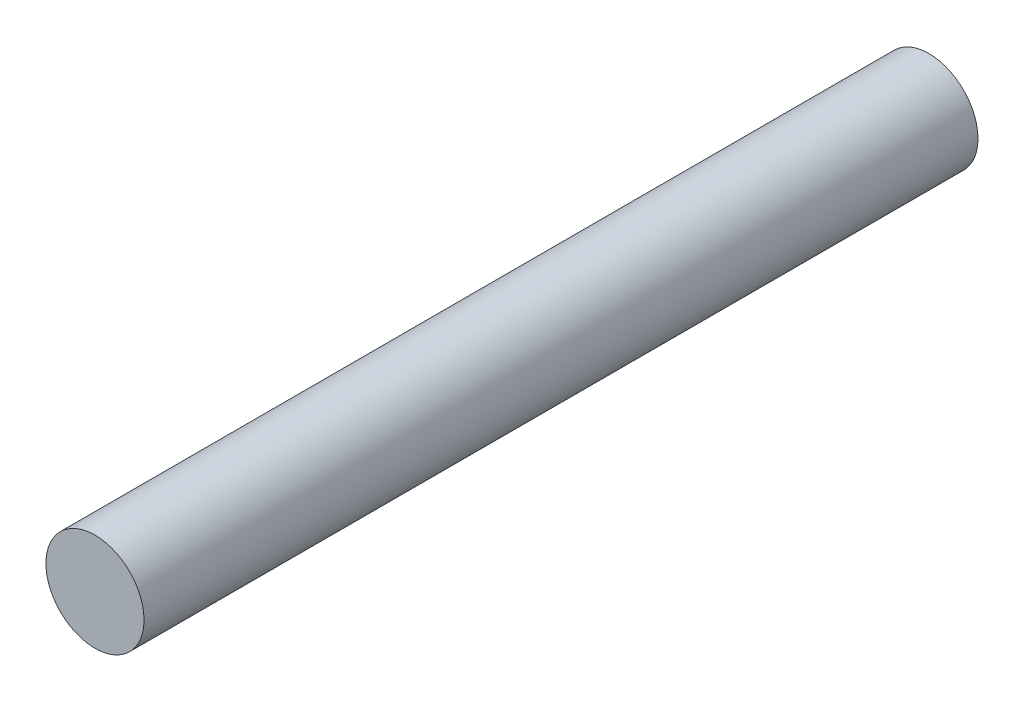
ISO-10303-21;
HEADER;
FILE_DESCRIPTION(('STEP AP214'),'2;1');
FILE_NAME('part.step','',(''),(''),'','','');
FILE_SCHEMA(('AUTOMOTIVE_DESIGN { 1 0 10303 214 1 1 1 1 }'));
ENDSEC;
DATA;
#1=APPLICATION_CONTEXT('core data for automotive mechanical design processes');
#2=APPLICATION_PROTOCOL_DEFINITION('international standard','automotive_design',2000,#1);
#3=PRODUCT_CONTEXT('',#1,'mechanical');
#4=PRODUCT('Part','Part','',(#3));
#5=PRODUCT_RELATED_PRODUCT_CATEGORY('part','',(#4));
#6=PRODUCT_DEFINITION_FORMATION('','',#4);
#7=PRODUCT_DEFINITION_CONTEXT('part definition',#1,'design');
#8=PRODUCT_DEFINITION('design','',#6,#7);
#9=PRODUCT_DEFINITION_SHAPE('','',#8);
#10=(LENGTH_UNIT() NAMED_UNIT(*) SI_UNIT(.MILLI.,.METRE.));
#11=(NAMED_UNIT(*) PLANE_ANGLE_UNIT() SI_UNIT($,.RADIAN.));
#12=(NAMED_UNIT(*) SI_UNIT($,.STERADIAN.) SOLID_ANGLE_UNIT());
#13=UNCERTAINTY_MEASURE_WITH_UNIT(LENGTH_MEASURE(1.E-05),#10,'distance_accuracy_value','');
#14=(GEOMETRIC_REPRESENTATION_CONTEXT(3) GLOBAL_UNCERTAINTY_ASSIGNED_CONTEXT((#13)) GLOBAL_UNIT_ASSIGNED_CONTEXT((#10,
#11,#12)) REPRESENTATION_CONTEXT('',''));
#15=CARTESIAN_POINT('',(0.,0.,0.));
#16=DIRECTION('',(0.,0.,1.));
#17=DIRECTION('',(1.,0.,0.));
#18=AXIS2_PLACEMENT_3D('',#15,#16,#17);
#19=CARTESIAN_POINT('',(0.,0.,34.));
#20=DIRECTION('',(0.,0.,-1.));
#21=DIRECTION('',(-1.,0.,0.));
#22=AXIS2_PLACEMENT_3D('',#19,#20,#21);
#23=CYLINDRICAL_SURFACE('',#22,2.);
#24=CARTESIAN_POINT('',(0.,0.,34.));
#25=DIRECTION('',(0.,0.,1.));
#26=DIRECTION('',(1.,0.,0.));
#27=AXIS2_PLACEMENT_3D('',#24,#25,#26);
#28=CIRCLE('',#27,2.);
#29=CARTESIAN_POINT('',(2.,0.,34.));
#30=VERTEX_POINT('',#29);
#31=EDGE_CURVE('E10',#30,#30,#28,.T.);
#32=ORIENTED_EDGE('',*,*,#31,.F.);
#33=EDGE_LOOP('',(#32));
#34=FACE_BOUND('',#33,.T.);
#35=CARTESIAN_POINT('',(0.,0.,0.));
#36=DIRECTION('',(0.,0.,1.));
#37=DIRECTION('',(1.,0.,0.));
#38=AXIS2_PLACEMENT_3D('',#35,#36,#37);
#39=CIRCLE('',#38,2.);
#40=CARTESIAN_POINT('',(2.,0.,0.));
#41=VERTEX_POINT('',#40);
#42=EDGE_CURVE('E34',#41,#41,#39,.T.);
#43=ORIENTED_EDGE('',*,*,#42,.T.);
#44=EDGE_LOOP('',(#43));
#45=FACE_BOUND('',#44,.T.);
#46=ADVANCED_FACE('F31',(#34,#45),#23,.T.);
#47=CARTESIAN_POINT('',(0.,0.,34.));
#48=DIRECTION('',(0.,0.,1.));
#49=DIRECTION('',(1.,0.,0.));
#50=AXIS2_PLACEMENT_3D('',#47,#48,#49);
#51=PLANE('',#50);
#52=ORIENTED_EDGE('',*,*,#31,.T.);
#53=EDGE_LOOP('',(#52));
#54=FACE_BOUND('',#53,.T.);
#55=ADVANCED_FACE('F46',(#54),#51,.T.);
#56=CARTESIAN_POINT('',(0.,0.,0.));
#57=DIRECTION('',(0.,0.,1.));
#58=DIRECTION('',(1.,0.,0.));
#59=AXIS2_PLACEMENT_3D('',#56,#57,#58);
#60=PLANE('',#59);
#61=ORIENTED_EDGE('',*,*,#42,.F.);
#62=EDGE_LOOP('',(#61));
#63=FACE_BOUND('',#62,.T.);
#64=ADVANCED_FACE('F44',(#63),#60,.F.);
#65=CLOSED_SHELL('',(#46,#55,#64));
#66=MANIFOLD_SOLID_BREP('B2',#65);
#67=ADVANCED_BREP_SHAPE_REPRESENTATION('',(#18,#66),#14);
#68=SHAPE_DEFINITION_REPRESENTATION(#9,#67);
ENDSEC;
END-ISO-10303-21;
